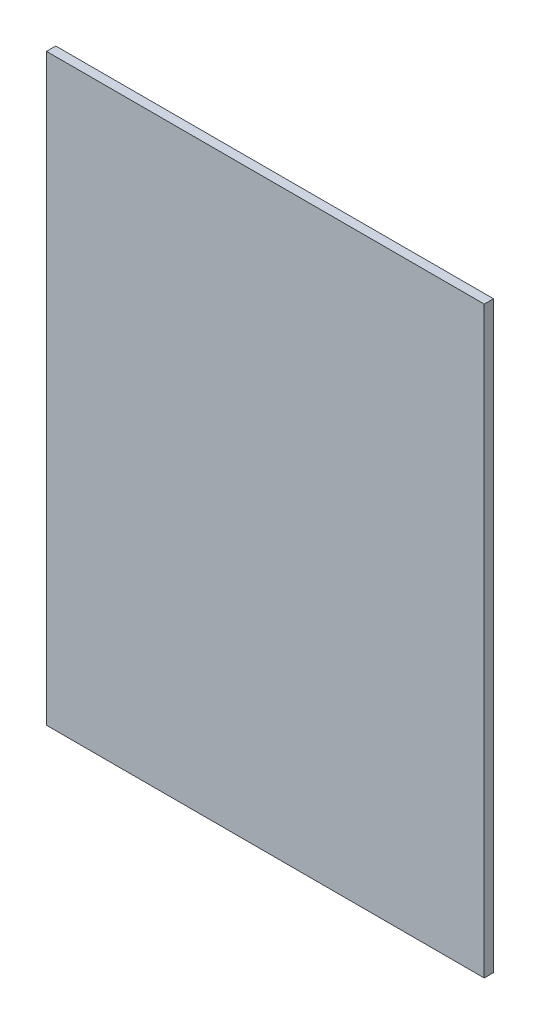
ISO-10303-21;
HEADER;
FILE_DESCRIPTION(('STEP AP214'),'2;1');
FILE_NAME('part.step','',(''),(''),'','','');
FILE_SCHEMA(('AUTOMOTIVE_DESIGN { 1 0 10303 214 1 1 1 1 }'));
ENDSEC;
DATA;
#1=APPLICATION_CONTEXT('core data for automotive mechanical design processes');
#2=APPLICATION_PROTOCOL_DEFINITION('international standard','automotive_design',2000,#1);
#3=PRODUCT_CONTEXT('',#1,'mechanical');
#4=PRODUCT('Part','Part','',(#3));
#5=PRODUCT_RELATED_PRODUCT_CATEGORY('part','',(#4));
#6=PRODUCT_DEFINITION_FORMATION('','',#4);
#7=PRODUCT_DEFINITION_CONTEXT('part definition',#1,'design');
#8=PRODUCT_DEFINITION('design','',#6,#7);
#9=PRODUCT_DEFINITION_SHAPE('','',#8);
#10=(LENGTH_UNIT() NAMED_UNIT(*) SI_UNIT(.MILLI.,.METRE.));
#11=(NAMED_UNIT(*) PLANE_ANGLE_UNIT() SI_UNIT($,.RADIAN.));
#12=(NAMED_UNIT(*) SI_UNIT($,.STERADIAN.) SOLID_ANGLE_UNIT());
#13=UNCERTAINTY_MEASURE_WITH_UNIT(LENGTH_MEASURE(1.E-05),#10,'distance_accuracy_value','');
#14=(GEOMETRIC_REPRESENTATION_CONTEXT(3) GLOBAL_UNCERTAINTY_ASSIGNED_CONTEXT((#13)) GLOBAL_UNIT_ASSIGNED_CONTEXT((#10,
#11,#12)) REPRESENTATION_CONTEXT('',''));
#15=CARTESIAN_POINT('',(0.,0.,0.));
#16=DIRECTION('',(0.,0.,1.));
#17=DIRECTION('',(1.,0.,0.));
#18=AXIS2_PLACEMENT_3D('',#15,#16,#17);
#19=CARTESIAN_POINT('',(-37.067615658363,383.174377224199,6.35));
#20=DIRECTION('',(1.,0.,0.));
#21=DIRECTION('',(0.,1.,0.));
#22=AXIS2_PLACEMENT_3D('',#19,#20,#21);
#23=PLANE('',#22);
#24=DIRECTION('',(0.,-1.,0.));
#25=VECTOR('',#24,1.);
#26=CARTESIAN_POINT('',(-37.067615658363,383.174377224199,0.));
#27=LINE('',#26,#25);
#28=CARTESIAN_POINT('',(-37.067615658363,383.174377224199,0.));
#29=VERTEX_POINT('',#28);
#30=CARTESIAN_POINT('',(-37.067615658363,-16.8256227758007,0.));
#31=VERTEX_POINT('',#30);
#32=EDGE_CURVE('E106',#29,#31,#27,.T.);
#33=ORIENTED_EDGE('',*,*,#32,.T.);
#34=DIRECTION('',(0.,0.,-1.));
#35=VECTOR('',#34,1.);
#36=CARTESIAN_POINT('',(-37.067615658363,-16.8256227758007,6.35));
#37=LINE('',#36,#35);
#38=CARTESIAN_POINT('',(-37.067615658363,-16.8256227758007,6.35));
#39=VERTEX_POINT('',#38);
#40=EDGE_CURVE('E11',#39,#31,#37,.T.);
#41=ORIENTED_EDGE('',*,*,#40,.F.);
#42=DIRECTION('',(0.,-1.,0.));
#43=VECTOR('',#42,1.);
#44=CARTESIAN_POINT('',(-37.067615658363,383.174377224199,6.35));
#45=LINE('',#44,#43);
#46=CARTESIAN_POINT('',(-37.067615658363,383.174377224199,6.35));
#47=VERTEX_POINT('',#46);
#48=EDGE_CURVE('E94',#47,#39,#45,.T.);
#49=ORIENTED_EDGE('',*,*,#48,.F.);
#50=DIRECTION('',(0.,0.,-1.));
#51=VECTOR('',#50,1.);
#52=CARTESIAN_POINT('',(-37.067615658363,383.174377224199,6.35));
#53=LINE('',#52,#51);
#54=EDGE_CURVE('E102',#47,#29,#53,.T.);
#55=ORIENTED_EDGE('',*,*,#54,.T.);
#56=EDGE_LOOP('',(#33,#41,#49,#55));
#57=FACE_BOUND('',#56,.T.);
#58=ADVANCED_FACE('F43',(#57),#23,.F.);
#59=CARTESIAN_POINT('',(-37.067615658363,-16.8256227758007,6.35));
#60=DIRECTION('',(0.,1.,0.));
#61=DIRECTION('',(0.,0.,1.));
#62=AXIS2_PLACEMENT_3D('',#59,#60,#61);
#63=PLANE('',#62);
#64=DIRECTION('',(1.,0.,0.));
#65=VECTOR('',#64,1.);
#66=CARTESIAN_POINT('',(-37.067615658363,-16.8256227758007,0.));
#67=LINE('',#66,#65);
#68=CARTESIAN_POINT('',(262.932384341637,-16.8256227758007,0.));
#69=VERTEX_POINT('',#68);
#70=EDGE_CURVE('E98',#31,#69,#67,.T.);
#71=ORIENTED_EDGE('',*,*,#70,.T.);
#72=DIRECTION('',(0.,0.,-1.));
#73=VECTOR('',#72,1.);
#74=CARTESIAN_POINT('',(262.932384341637,-16.8256227758007,6.35));
#75=LINE('',#74,#73);
#76=CARTESIAN_POINT('',(262.932384341637,-16.8256227758007,6.35));
#77=VERTEX_POINT('',#76);
#78=EDGE_CURVE('E51',#77,#69,#75,.T.);
#79=ORIENTED_EDGE('',*,*,#78,.F.);
#80=DIRECTION('',(1.,0.,0.));
#81=VECTOR('',#80,1.);
#82=CARTESIAN_POINT('',(-37.067615658363,-16.8256227758007,6.35));
#83=LINE('',#82,#81);
#84=EDGE_CURVE('E89',#39,#77,#83,.T.);
#85=ORIENTED_EDGE('',*,*,#84,.F.);
#86=ORIENTED_EDGE('',*,*,#40,.T.);
#87=EDGE_LOOP('',(#71,#79,#85,#86));
#88=FACE_BOUND('',#87,.T.);
#89=ADVANCED_FACE('F97',(#88),#63,.F.);
#90=CARTESIAN_POINT('',(262.932384341637,383.174377224199,6.35));
#91=DIRECTION('',(-1.,0.,0.));
#92=DIRECTION('',(0.,-1.,0.));
#93=AXIS2_PLACEMENT_3D('',#90,#91,#92);
#94=PLANE('',#93);
#95=DIRECTION('',(0.,1.,0.));
#96=VECTOR('',#95,1.);
#97=CARTESIAN_POINT('',(262.932384341637,383.174377224199,0.));
#98=LINE('',#97,#96);
#99=CARTESIAN_POINT('',(262.932384341637,383.174377224199,0.));
#100=VERTEX_POINT('',#99);
#101=EDGE_CURVE('E76',#69,#100,#98,.T.);
#102=ORIENTED_EDGE('',*,*,#101,.T.);
#103=DIRECTION('',(0.,0.,-1.));
#104=VECTOR('',#103,1.);
#105=CARTESIAN_POINT('',(262.932384341637,383.174377224199,6.35));
#106=LINE('',#105,#104);
#107=CARTESIAN_POINT('',(262.932384341637,383.174377224199,6.35));
#108=VERTEX_POINT('',#107);
#109=EDGE_CURVE('E99',#108,#100,#106,.T.);
#110=ORIENTED_EDGE('',*,*,#109,.F.);
#111=DIRECTION('',(0.,1.,0.));
#112=VECTOR('',#111,1.);
#113=CARTESIAN_POINT('',(262.932384341637,383.174377224199,6.35));
#114=LINE('',#113,#112);
#115=EDGE_CURVE('E92',#77,#108,#114,.T.);
#116=ORIENTED_EDGE('',*,*,#115,.F.);
#117=ORIENTED_EDGE('',*,*,#78,.T.);
#118=EDGE_LOOP('',(#102,#110,#116,#117));
#119=FACE_BOUND('',#118,.T.);
#120=ADVANCED_FACE('F100',(#119),#94,.F.);
#121=CARTESIAN_POINT('',(-37.067615658363,383.174377224199,6.35));
#122=DIRECTION('',(0.,-1.,0.));
#123=DIRECTION('',(0.,0.,-1.));
#124=AXIS2_PLACEMENT_3D('',#121,#122,#123);
#125=PLANE('',#124);
#126=DIRECTION('',(-1.,0.,0.));
#127=VECTOR('',#126,1.);
#128=CARTESIAN_POINT('',(-37.067615658363,383.174377224199,0.));
#129=LINE('',#128,#127);
#130=EDGE_CURVE('E82',#100,#29,#129,.T.);
#131=ORIENTED_EDGE('',*,*,#130,.T.);
#132=ORIENTED_EDGE('',*,*,#54,.F.);
#133=DIRECTION('',(-1.,0.,0.));
#134=VECTOR('',#133,1.);
#135=CARTESIAN_POINT('',(-37.067615658363,383.174377224199,6.35));
#136=LINE('',#135,#134);
#137=EDGE_CURVE('E59',#108,#47,#136,.T.);
#138=ORIENTED_EDGE('',*,*,#137,.F.);
#139=ORIENTED_EDGE('',*,*,#109,.T.);
#140=EDGE_LOOP('',(#131,#132,#138,#139));
#141=FACE_BOUND('',#140,.T.);
#142=ADVANCED_FACE('F113',(#141),#125,.F.);
#143=CARTESIAN_POINT('',(0.,0.,6.35));
#144=DIRECTION('',(0.,0.,1.));
#145=DIRECTION('',(1.,0.,0.));
#146=AXIS2_PLACEMENT_3D('',#143,#144,#145);
#147=PLANE('',#146);
#148=ORIENTED_EDGE('',*,*,#48,.T.);
#149=ORIENTED_EDGE('',*,*,#84,.T.);
#150=ORIENTED_EDGE('',*,*,#115,.T.);
#151=ORIENTED_EDGE('',*,*,#137,.T.);
#152=EDGE_LOOP('',(#148,#149,#150,#151));
#153=FACE_BOUND('',#152,.T.);
#154=ADVANCED_FACE('F90',(#153),#147,.T.);
#155=CARTESIAN_POINT('',(0.,0.,0.));
#156=DIRECTION('',(0.,0.,1.));
#157=DIRECTION('',(1.,0.,0.));
#158=AXIS2_PLACEMENT_3D('',#155,#156,#157);
#159=PLANE('',#158);
#160=ORIENTED_EDGE('',*,*,#32,.F.);
#161=ORIENTED_EDGE('',*,*,#130,.F.);
#162=ORIENTED_EDGE('',*,*,#101,.F.);
#163=ORIENTED_EDGE('',*,*,#70,.F.);
#164=EDGE_LOOP('',(#160,#161,#162,#163));
#165=FACE_BOUND('',#164,.T.);
#166=ADVANCED_FACE('F116',(#165),#159,.F.);
#167=CLOSED_SHELL('',(#58,#89,#120,#142,#154,#166));
#168=MANIFOLD_SOLID_BREP('B2',#167);
#169=ADVANCED_BREP_SHAPE_REPRESENTATION('',(#18,#168),#14);
#170=SHAPE_DEFINITION_REPRESENTATION(#9,#169);
ENDSEC;
END-ISO-10303-21;
